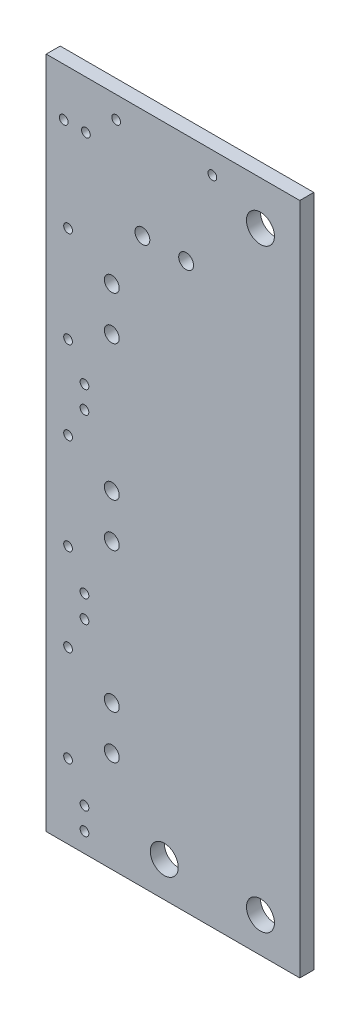
ISO-10303-21;
HEADER;
FILE_DESCRIPTION(('STEP AP214'),'2;1');
FILE_NAME('part.step','',(''),(''),'','','');
FILE_SCHEMA(('AUTOMOTIVE_DESIGN { 1 0 10303 214 1 1 1 1 }'));
ENDSEC;
DATA;
#1=APPLICATION_CONTEXT('core data for automotive mechanical design processes');
#2=APPLICATION_PROTOCOL_DEFINITION('international standard','automotive_design',2000,#1);
#3=PRODUCT_CONTEXT('',#1,'mechanical');
#4=PRODUCT('Part','Part','',(#3));
#5=PRODUCT_RELATED_PRODUCT_CATEGORY('part','',(#4));
#6=PRODUCT_DEFINITION_FORMATION('','',#4);
#7=PRODUCT_DEFINITION_CONTEXT('part definition',#1,'design');
#8=PRODUCT_DEFINITION('design','',#6,#7);
#9=PRODUCT_DEFINITION_SHAPE('','',#8);
#10=(LENGTH_UNIT() NAMED_UNIT(*) SI_UNIT(.MILLI.,.METRE.));
#11=(NAMED_UNIT(*) PLANE_ANGLE_UNIT() SI_UNIT($,.RADIAN.));
#12=(NAMED_UNIT(*) SI_UNIT($,.STERADIAN.) SOLID_ANGLE_UNIT());
#13=UNCERTAINTY_MEASURE_WITH_UNIT(LENGTH_MEASURE(1.E-05),#10,'distance_accuracy_value','');
#14=(GEOMETRIC_REPRESENTATION_CONTEXT(3) GLOBAL_UNCERTAINTY_ASSIGNED_CONTEXT((#13)) GLOBAL_UNIT_ASSIGNED_CONTEXT((#10,
#11,#12)) REPRESENTATION_CONTEXT('',''));
#15=CARTESIAN_POINT('',(0.,0.,0.));
#16=DIRECTION('',(0.,0.,1.));
#17=DIRECTION('',(1.,0.,0.));
#18=AXIS2_PLACEMENT_3D('',#15,#16,#17);
#19=CARTESIAN_POINT('',(126.,-46.,-0.045));
#20=DIRECTION('',(0.,0.,-1.));
#21=DIRECTION('',(0.,-1.,0.));
#22=AXIS2_PLACEMENT_3D('',#19,#20,#21);
#23=CYLINDRICAL_SURFACE('',#22,1.6);
#24=CARTESIAN_POINT('',(126.,-46.,0.));
#25=DIRECTION('',(0.,0.,-1.));
#26=DIRECTION('',(0.,-1.,0.));
#27=AXIS2_PLACEMENT_3D('',#24,#25,#26);
#28=CIRCLE('',#27,1.6);
#29=CARTESIAN_POINT('',(126.,-47.6,0.));
#30=VERTEX_POINT('',#29);
#31=EDGE_CURVE('E498',#30,#30,#28,.T.);
#32=ORIENTED_EDGE('',*,*,#31,.T.);
#33=DIRECTION('',(0.,0.,1.));
#34=VECTOR('',#33,1.);
#35=CARTESIAN_POINT('',(126.,-47.6,-0.045));
#36=LINE('',#35,#34);
#37=CARTESIAN_POINT('',(126.,-47.6,1.6));
#38=VERTEX_POINT('',#37);
#39=EDGE_CURVE('E11',#30,#38,#36,.T.);
#40=ORIENTED_EDGE('',*,*,#39,.T.);
#41=CARTESIAN_POINT('',(126.,-46.,1.6));
#42=DIRECTION('',(0.,0.,-1.));
#43=DIRECTION('',(0.,-1.,0.));
#44=AXIS2_PLACEMENT_3D('',#41,#42,#43);
#45=CIRCLE('',#44,1.6);
#46=EDGE_CURVE('E516',#38,#38,#45,.T.);
#47=ORIENTED_EDGE('',*,*,#46,.F.);
#48=ORIENTED_EDGE('',*,*,#39,.F.);
#49=EDGE_LOOP('',(#32,#40,#47,#48));
#50=FACE_BOUND('',#49,.T.);
#51=ADVANCED_FACE('F17',(#50),#23,.F.);
#52=CARTESIAN_POINT('',(120.5,-43.5,-0.045));
#53=DIRECTION('',(0.,0.,-1.));
#54=DIRECTION('',(0.,-1.,0.));
#55=AXIS2_PLACEMENT_3D('',#52,#53,#54);
#56=CYLINDRICAL_SURFACE('',#55,0.5);
#57=CARTESIAN_POINT('',(120.5,-43.5,0.));
#58=DIRECTION('',(0.,0.,-1.));
#59=DIRECTION('',(0.,-1.,0.));
#60=AXIS2_PLACEMENT_3D('',#57,#58,#59);
#61=CIRCLE('',#60,0.5);
#62=CARTESIAN_POINT('',(120.5,-44.,0.));
#63=VERTEX_POINT('',#62);
#64=EDGE_CURVE('E501',#63,#63,#61,.T.);
#65=ORIENTED_EDGE('',*,*,#64,.T.);
#66=DIRECTION('',(0.,0.,1.));
#67=VECTOR('',#66,1.);
#68=CARTESIAN_POINT('',(120.5,-44.,-0.045));
#69=LINE('',#68,#67);
#70=CARTESIAN_POINT('',(120.5,-44.,1.6));
#71=VERTEX_POINT('',#70);
#72=EDGE_CURVE('E26',#63,#71,#69,.T.);
#73=ORIENTED_EDGE('',*,*,#72,.T.);
#74=CARTESIAN_POINT('',(120.5,-43.5,1.6));
#75=DIRECTION('',(0.,0.,-1.));
#76=DIRECTION('',(0.,-1.,0.));
#77=AXIS2_PLACEMENT_3D('',#74,#75,#76);
#78=CIRCLE('',#77,0.5);
#79=EDGE_CURVE('E519',#71,#71,#78,.T.);
#80=ORIENTED_EDGE('',*,*,#79,.F.);
#81=ORIENTED_EDGE('',*,*,#72,.F.);
#82=EDGE_LOOP('',(#65,#73,#80,#81));
#83=FACE_BOUND('',#82,.T.);
#84=ADVANCED_FACE('F19',(#83),#56,.F.);
#85=CARTESIAN_POINT('',(117.5,-53.5,-0.045));
#86=DIRECTION('',(0.,0.,-1.));
#87=DIRECTION('',(0.,-1.,0.));
#88=AXIS2_PLACEMENT_3D('',#85,#86,#87);
#89=CYLINDRICAL_SURFACE('',#88,0.85);
#90=CARTESIAN_POINT('',(117.5,-53.5,0.));
#91=DIRECTION('',(0.,0.,-1.));
#92=DIRECTION('',(0.,-1.,0.));
#93=AXIS2_PLACEMENT_3D('',#90,#91,#92);
#94=CIRCLE('',#93,0.85);
#95=CARTESIAN_POINT('',(117.5,-54.35,0.));
#96=VERTEX_POINT('',#95);
#97=EDGE_CURVE('E505',#96,#96,#94,.T.);
#98=ORIENTED_EDGE('',*,*,#97,.T.);
#99=DIRECTION('',(0.,0.,1.));
#100=VECTOR('',#99,1.);
#101=CARTESIAN_POINT('',(117.5,-54.35,-0.045));
#102=LINE('',#101,#100);
#103=CARTESIAN_POINT('',(117.5,-54.35,1.6));
#104=VERTEX_POINT('',#103);
#105=EDGE_CURVE('E576',#96,#104,#102,.T.);
#106=ORIENTED_EDGE('',*,*,#105,.T.);
#107=CARTESIAN_POINT('',(117.5,-53.5,1.6));
#108=DIRECTION('',(0.,0.,-1.));
#109=DIRECTION('',(0.,-1.,0.));
#110=AXIS2_PLACEMENT_3D('',#107,#108,#109);
#111=CIRCLE('',#110,0.85);
#112=EDGE_CURVE('E563',#104,#104,#111,.T.);
#113=ORIENTED_EDGE('',*,*,#112,.F.);
#114=ORIENTED_EDGE('',*,*,#105,.F.);
#115=EDGE_LOOP('',(#98,#106,#113,#114));
#116=FACE_BOUND('',#115,.T.);
#117=ADVANCED_FACE('F637',(#116),#89,.F.);
#118=CARTESIAN_POINT('',(109.5,-43.5,-0.045));
#119=DIRECTION('',(0.,0.,-1.));
#120=DIRECTION('',(0.,-1.,0.));
#121=AXIS2_PLACEMENT_3D('',#118,#119,#120);
#122=CYLINDRICAL_SURFACE('',#121,0.5);
#123=CARTESIAN_POINT('',(109.5,-43.5,0.));
#124=DIRECTION('',(0.,0.,-1.));
#125=DIRECTION('',(0.,-1.,0.));
#126=AXIS2_PLACEMENT_3D('',#123,#124,#125);
#127=CIRCLE('',#126,0.5);
#128=CARTESIAN_POINT('',(109.5,-44.,0.));
#129=VERTEX_POINT('',#128);
#130=EDGE_CURVE('E497',#129,#129,#127,.T.);
#131=ORIENTED_EDGE('',*,*,#130,.T.);
#132=DIRECTION('',(0.,0.,1.));
#133=VECTOR('',#132,1.);
#134=CARTESIAN_POINT('',(109.5,-44.,-0.045));
#135=LINE('',#134,#133);
#136=CARTESIAN_POINT('',(109.5,-44.,1.6));
#137=VERTEX_POINT('',#136);
#138=EDGE_CURVE('E630',#129,#137,#135,.T.);
#139=ORIENTED_EDGE('',*,*,#138,.T.);
#140=CARTESIAN_POINT('',(109.5,-43.5,1.6));
#141=DIRECTION('',(0.,0.,-1.));
#142=DIRECTION('',(0.,-1.,0.));
#143=AXIS2_PLACEMENT_3D('',#140,#141,#142);
#144=CIRCLE('',#143,0.5);
#145=EDGE_CURVE('E567',#137,#137,#144,.T.);
#146=ORIENTED_EDGE('',*,*,#145,.F.);
#147=ORIENTED_EDGE('',*,*,#138,.F.);
#148=EDGE_LOOP('',(#131,#139,#146,#147));
#149=FACE_BOUND('',#148,.T.);
#150=ADVANCED_FACE('F772',(#149),#122,.F.);
#151=CARTESIAN_POINT('',(112.5,-53.5,-0.045));
#152=DIRECTION('',(0.,0.,-1.));
#153=DIRECTION('',(0.,-1.,0.));
#154=AXIS2_PLACEMENT_3D('',#151,#152,#153);
#155=CYLINDRICAL_SURFACE('',#154,0.85);
#156=CARTESIAN_POINT('',(112.5,-53.5,0.));
#157=DIRECTION('',(0.,0.,-1.));
#158=DIRECTION('',(0.,-1.,0.));
#159=AXIS2_PLACEMENT_3D('',#156,#157,#158);
#160=CIRCLE('',#159,0.85);
#161=CARTESIAN_POINT('',(112.5,-54.35,0.));
#162=VERTEX_POINT('',#161);
#163=EDGE_CURVE('E491',#162,#162,#160,.T.);
#164=ORIENTED_EDGE('',*,*,#163,.T.);
#165=DIRECTION('',(0.,0.,1.));
#166=VECTOR('',#165,1.);
#167=CARTESIAN_POINT('',(112.5,-54.35,-0.045));
#168=LINE('',#167,#166);
#169=CARTESIAN_POINT('',(112.5,-54.35,1.6));
#170=VERTEX_POINT('',#169);
#171=EDGE_CURVE('E625',#162,#170,#168,.T.);
#172=ORIENTED_EDGE('',*,*,#171,.T.);
#173=CARTESIAN_POINT('',(112.5,-53.5,1.6));
#174=DIRECTION('',(0.,0.,-1.));
#175=DIRECTION('',(0.,-1.,0.));
#176=AXIS2_PLACEMENT_3D('',#173,#174,#175);
#177=CIRCLE('',#176,0.85);
#178=EDGE_CURVE('E586',#170,#170,#177,.T.);
#179=ORIENTED_EDGE('',*,*,#178,.F.);
#180=ORIENTED_EDGE('',*,*,#171,.F.);
#181=EDGE_LOOP('',(#164,#172,#179,#180));
#182=FACE_BOUND('',#181,.T.);
#183=ADVANCED_FACE('F770',(#182),#155,.F.);
#184=CARTESIAN_POINT('',(106.04,-46.5,-0.045));
#185=DIRECTION('',(0.,0.,-1.));
#186=DIRECTION('',(0.,-1.,0.));
#187=AXIS2_PLACEMENT_3D('',#184,#185,#186);
#188=CYLINDRICAL_SURFACE('',#187,0.5);
#189=CARTESIAN_POINT('',(106.04,-46.5,0.));
#190=DIRECTION('',(0.,0.,-1.));
#191=DIRECTION('',(0.,-1.,0.));
#192=AXIS2_PLACEMENT_3D('',#189,#190,#191);
#193=CIRCLE('',#192,0.5);
#194=CARTESIAN_POINT('',(106.04,-47.,0.));
#195=VERTEX_POINT('',#194);
#196=EDGE_CURVE('E481',#195,#195,#193,.T.);
#197=ORIENTED_EDGE('',*,*,#196,.T.);
#198=DIRECTION('',(0.,0.,1.));
#199=VECTOR('',#198,1.);
#200=CARTESIAN_POINT('',(106.04,-47.,-0.045));
#201=LINE('',#200,#199);
#202=CARTESIAN_POINT('',(106.04,-47.,1.6));
#203=VERTEX_POINT('',#202);
#204=EDGE_CURVE('E622',#195,#203,#201,.T.);
#205=ORIENTED_EDGE('',*,*,#204,.T.);
#206=CARTESIAN_POINT('',(106.04,-46.5,1.6));
#207=DIRECTION('',(0.,0.,-1.));
#208=DIRECTION('',(0.,-1.,0.));
#209=AXIS2_PLACEMENT_3D('',#206,#207,#208);
#210=CIRCLE('',#209,0.5);
#211=EDGE_CURVE('E582',#203,#203,#210,.T.);
#212=ORIENTED_EDGE('',*,*,#211,.F.);
#213=ORIENTED_EDGE('',*,*,#204,.F.);
#214=EDGE_LOOP('',(#197,#205,#212,#213));
#215=FACE_BOUND('',#214,.T.);
#216=ADVANCED_FACE('F766',(#215),#188,.F.);
#217=CARTESIAN_POINT('',(103.5,-46.5,-0.045));
#218=DIRECTION('',(0.,0.,-1.));
#219=DIRECTION('',(0.,-1.,0.));
#220=AXIS2_PLACEMENT_3D('',#217,#218,#219);
#221=CYLINDRICAL_SURFACE('',#220,0.5);
#222=CARTESIAN_POINT('',(103.5,-46.5,0.));
#223=DIRECTION('',(0.,0.,-1.));
#224=DIRECTION('',(0.,-1.,0.));
#225=AXIS2_PLACEMENT_3D('',#222,#223,#224);
#226=CIRCLE('',#225,0.5);
#227=CARTESIAN_POINT('',(103.5,-47.,0.));
#228=VERTEX_POINT('',#227);
#229=EDGE_CURVE('E477',#228,#228,#226,.T.);
#230=ORIENTED_EDGE('',*,*,#229,.T.);
#231=DIRECTION('',(0.,0.,1.));
#232=VECTOR('',#231,1.);
#233=CARTESIAN_POINT('',(103.5,-47.,-0.045));
#234=LINE('',#233,#232);
#235=CARTESIAN_POINT('',(103.5,-47.,1.6));
#236=VERTEX_POINT('',#235);
#237=EDGE_CURVE('E621',#228,#236,#234,.T.);
#238=ORIENTED_EDGE('',*,*,#237,.T.);
#239=CARTESIAN_POINT('',(103.5,-46.5,1.6));
#240=DIRECTION('',(0.,0.,-1.));
#241=DIRECTION('',(0.,-1.,0.));
#242=AXIS2_PLACEMENT_3D('',#239,#240,#241);
#243=CIRCLE('',#242,0.5);
#244=EDGE_CURVE('E363',#236,#236,#243,.T.);
#245=ORIENTED_EDGE('',*,*,#244,.F.);
#246=ORIENTED_EDGE('',*,*,#237,.F.);
#247=EDGE_LOOP('',(#230,#238,#245,#246));
#248=FACE_BOUND('',#247,.T.);
#249=ADVANCED_FACE('F762',(#248),#221,.F.);
#250=CARTESIAN_POINT('',(109.,-60.,-0.045));
#251=DIRECTION('',(0.,0.,-1.));
#252=DIRECTION('',(0.,-1.,0.));
#253=AXIS2_PLACEMENT_3D('',#250,#251,#252);
#254=CYLINDRICAL_SURFACE('',#253,0.85);
#255=CARTESIAN_POINT('',(109.,-60.,0.));
#256=DIRECTION('',(0.,0.,-1.));
#257=DIRECTION('',(0.,-1.,0.));
#258=AXIS2_PLACEMENT_3D('',#255,#256,#257);
#259=CIRCLE('',#258,0.85);
#260=CARTESIAN_POINT('',(109.,-60.85,0.));
#261=VERTEX_POINT('',#260);
#262=EDGE_CURVE('E473',#261,#261,#259,.T.);
#263=ORIENTED_EDGE('',*,*,#262,.T.);
#264=DIRECTION('',(0.,0.,1.));
#265=VECTOR('',#264,1.);
#266=CARTESIAN_POINT('',(109.,-60.85,-0.045));
#267=LINE('',#266,#265);
#268=CARTESIAN_POINT('',(109.,-60.85,1.6));
#269=VERTEX_POINT('',#268);
#270=EDGE_CURVE('E410',#261,#269,#267,.T.);
#271=ORIENTED_EDGE('',*,*,#270,.T.);
#272=CARTESIAN_POINT('',(109.,-60.,1.6));
#273=DIRECTION('',(0.,0.,-1.));
#274=DIRECTION('',(0.,-1.,0.));
#275=AXIS2_PLACEMENT_3D('',#272,#273,#274);
#276=CIRCLE('',#275,0.85);
#277=EDGE_CURVE('E359',#269,#269,#276,.T.);
#278=ORIENTED_EDGE('',*,*,#277,.F.);
#279=ORIENTED_EDGE('',*,*,#270,.F.);
#280=EDGE_LOOP('',(#263,#271,#278,#279));
#281=FACE_BOUND('',#280,.T.);
#282=ADVANCED_FACE('F744',(#281),#254,.F.);
#283=CARTESIAN_POINT('',(104.,-57.,-0.045));
#284=DIRECTION('',(0.,0.,-1.));
#285=DIRECTION('',(0.,-1.,0.));
#286=AXIS2_PLACEMENT_3D('',#283,#284,#285);
#287=CYLINDRICAL_SURFACE('',#286,0.5);
#288=CARTESIAN_POINT('',(104.,-57.,0.));
#289=DIRECTION('',(0.,0.,-1.));
#290=DIRECTION('',(0.,-1.,0.));
#291=AXIS2_PLACEMENT_3D('',#288,#289,#290);
#292=CIRCLE('',#291,0.5);
#293=CARTESIAN_POINT('',(104.,-57.5,0.));
#294=VERTEX_POINT('',#293);
#295=EDGE_CURVE('E461',#294,#294,#292,.T.);
#296=ORIENTED_EDGE('',*,*,#295,.T.);
#297=DIRECTION('',(0.,0.,1.));
#298=VECTOR('',#297,1.);
#299=CARTESIAN_POINT('',(104.,-57.5,-0.045));
#300=LINE('',#299,#298);
#301=CARTESIAN_POINT('',(104.,-57.5,1.6));
#302=VERTEX_POINT('',#301);
#303=EDGE_CURVE('E407',#294,#302,#300,.T.);
#304=ORIENTED_EDGE('',*,*,#303,.T.);
#305=CARTESIAN_POINT('',(104.,-57.,1.6));
#306=DIRECTION('',(0.,0.,-1.));
#307=DIRECTION('',(0.,-1.,0.));
#308=AXIS2_PLACEMENT_3D('',#305,#306,#307);
#309=CIRCLE('',#308,0.5);
#310=EDGE_CURVE('E364',#302,#302,#309,.T.);
#311=ORIENTED_EDGE('',*,*,#310,.F.);
#312=ORIENTED_EDGE('',*,*,#303,.F.);
#313=EDGE_LOOP('',(#296,#304,#311,#312));
#314=FACE_BOUND('',#313,.T.);
#315=ADVANCED_FACE('F740',(#314),#287,.F.);
#316=CARTESIAN_POINT('',(109.,-65.,-0.045));
#317=DIRECTION('',(0.,0.,-1.));
#318=DIRECTION('',(0.,-1.,0.));
#319=AXIS2_PLACEMENT_3D('',#316,#317,#318);
#320=CYLINDRICAL_SURFACE('',#319,0.85);
#321=CARTESIAN_POINT('',(109.,-65.,0.));
#322=DIRECTION('',(0.,0.,-1.));
#323=DIRECTION('',(0.,-1.,0.));
#324=AXIS2_PLACEMENT_3D('',#321,#322,#323);
#325=CIRCLE('',#324,0.85);
#326=CARTESIAN_POINT('',(109.,-65.85,0.));
#327=VERTEX_POINT('',#326);
#328=EDGE_CURVE('E454',#327,#327,#325,.T.);
#329=ORIENTED_EDGE('',*,*,#328,.T.);
#330=DIRECTION('',(0.,0.,1.));
#331=VECTOR('',#330,1.);
#332=CARTESIAN_POINT('',(109.,-65.85,-0.045));
#333=LINE('',#332,#331);
#334=CARTESIAN_POINT('',(109.,-65.85,1.6));
#335=VERTEX_POINT('',#334);
#336=EDGE_CURVE('E411',#327,#335,#333,.T.);
#337=ORIENTED_EDGE('',*,*,#336,.T.);
#338=CARTESIAN_POINT('',(109.,-65.,1.6));
#339=DIRECTION('',(0.,0.,-1.));
#340=DIRECTION('',(0.,-1.,0.));
#341=AXIS2_PLACEMENT_3D('',#338,#339,#340);
#342=CIRCLE('',#341,0.85);
#343=EDGE_CURVE('E443',#335,#335,#342,.T.);
#344=ORIENTED_EDGE('',*,*,#343,.F.);
#345=ORIENTED_EDGE('',*,*,#336,.F.);
#346=EDGE_LOOP('',(#329,#337,#344,#345));
#347=FACE_BOUND('',#346,.T.);
#348=ADVANCED_FACE('F743',(#347),#320,.F.);
#349=CARTESIAN_POINT('',(104.,-68.,-0.045));
#350=DIRECTION('',(0.,0.,-1.));
#351=DIRECTION('',(0.,-1.,0.));
#352=AXIS2_PLACEMENT_3D('',#349,#350,#351);
#353=CYLINDRICAL_SURFACE('',#352,0.5);
#354=CARTESIAN_POINT('',(104.,-68.,0.));
#355=DIRECTION('',(0.,0.,-1.));
#356=DIRECTION('',(0.,-1.,0.));
#357=AXIS2_PLACEMENT_3D('',#354,#355,#356);
#358=CIRCLE('',#357,0.5);
#359=CARTESIAN_POINT('',(104.,-68.5,0.));
#360=VERTEX_POINT('',#359);
#361=EDGE_CURVE('E354',#360,#360,#358,.T.);
#362=ORIENTED_EDGE('',*,*,#361,.T.);
#363=DIRECTION('',(0.,0.,1.));
#364=VECTOR('',#363,1.);
#365=CARTESIAN_POINT('',(104.,-68.5,-0.045));
#366=LINE('',#365,#364);
#367=CARTESIAN_POINT('',(104.,-68.5,1.6));
#368=VERTEX_POINT('',#367);
#369=EDGE_CURVE('E382',#360,#368,#366,.T.);
#370=ORIENTED_EDGE('',*,*,#369,.T.);
#371=CARTESIAN_POINT('',(104.,-68.,1.6));
#372=DIRECTION('',(0.,0.,-1.));
#373=DIRECTION('',(0.,-1.,0.));
#374=AXIS2_PLACEMENT_3D('',#371,#372,#373);
#375=CIRCLE('',#374,0.5);
#376=EDGE_CURVE('E447',#368,#368,#375,.T.);
#377=ORIENTED_EDGE('',*,*,#376,.F.);
#378=ORIENTED_EDGE('',*,*,#369,.F.);
#379=EDGE_LOOP('',(#362,#370,#377,#378));
#380=FACE_BOUND('',#379,.T.);
#381=ADVANCED_FACE('F752',(#380),#353,.F.);
#382=CARTESIAN_POINT('',(105.875,-71.5,-0.045));
#383=DIRECTION('',(0.,0.,-1.));
#384=DIRECTION('',(0.,-1.,0.));
#385=AXIS2_PLACEMENT_3D('',#382,#383,#384);
#386=CYLINDRICAL_SURFACE('',#385,0.5);
#387=CARTESIAN_POINT('',(105.875,-71.5,0.));
#388=DIRECTION('',(0.,0.,-1.));
#389=DIRECTION('',(0.,-1.,0.));
#390=AXIS2_PLACEMENT_3D('',#387,#388,#389);
#391=CIRCLE('',#390,0.5);
#392=CARTESIAN_POINT('',(105.875,-72.,0.));
#393=VERTEX_POINT('',#392);
#394=EDGE_CURVE('E351',#393,#393,#391,.T.);
#395=ORIENTED_EDGE('',*,*,#394,.T.);
#396=DIRECTION('',(0.,0.,1.));
#397=VECTOR('',#396,1.);
#398=CARTESIAN_POINT('',(105.875,-72.,-0.045));
#399=LINE('',#398,#397);
#400=CARTESIAN_POINT('',(105.875,-72.,1.6));
#401=VERTEX_POINT('',#400);
#402=EDGE_CURVE('E379',#393,#401,#399,.T.);
#403=ORIENTED_EDGE('',*,*,#402,.T.);
#404=CARTESIAN_POINT('',(105.875,-71.5,1.6));
#405=DIRECTION('',(0.,0.,-1.));
#406=DIRECTION('',(0.,-1.,0.));
#407=AXIS2_PLACEMENT_3D('',#404,#405,#406);
#408=CIRCLE('',#407,0.5);
#409=EDGE_CURVE('E533',#401,#401,#408,.T.);
#410=ORIENTED_EDGE('',*,*,#409,.F.);
#411=ORIENTED_EDGE('',*,*,#402,.F.);
#412=EDGE_LOOP('',(#395,#403,#410,#411));
#413=FACE_BOUND('',#412,.T.);
#414=ADVANCED_FACE('F748',(#413),#386,.F.);
#415=CARTESIAN_POINT('',(105.875,-74.04,-0.045));
#416=DIRECTION('',(0.,0.,-1.));
#417=DIRECTION('',(0.,-1.,0.));
#418=AXIS2_PLACEMENT_3D('',#415,#416,#417);
#419=CYLINDRICAL_SURFACE('',#418,0.5);
#420=CARTESIAN_POINT('',(105.875,-74.04,0.));
#421=DIRECTION('',(0.,0.,-1.));
#422=DIRECTION('',(0.,-1.,0.));
#423=AXIS2_PLACEMENT_3D('',#420,#421,#422);
#424=CIRCLE('',#423,0.5);
#425=CARTESIAN_POINT('',(105.875,-74.54,0.));
#426=VERTEX_POINT('',#425);
#427=EDGE_CURVE('E355',#426,#426,#424,.T.);
#428=ORIENTED_EDGE('',*,*,#427,.T.);
#429=DIRECTION('',(0.,0.,1.));
#430=VECTOR('',#429,1.);
#431=CARTESIAN_POINT('',(105.875,-74.54,-0.045));
#432=LINE('',#431,#430);
#433=CARTESIAN_POINT('',(105.875,-74.54,1.6));
#434=VERTEX_POINT('',#433);
#435=EDGE_CURVE('E383',#426,#434,#432,.T.);
#436=ORIENTED_EDGE('',*,*,#435,.T.);
#437=CARTESIAN_POINT('',(105.875,-74.04,1.6));
#438=DIRECTION('',(0.,0.,-1.));
#439=DIRECTION('',(0.,-1.,0.));
#440=AXIS2_PLACEMENT_3D('',#437,#438,#439);
#441=CIRCLE('',#440,0.5);
#442=EDGE_CURVE('E369',#434,#434,#441,.T.);
#443=ORIENTED_EDGE('',*,*,#442,.F.);
#444=ORIENTED_EDGE('',*,*,#435,.F.);
#445=EDGE_LOOP('',(#428,#436,#443,#444));
#446=FACE_BOUND('',#445,.T.);
#447=ADVANCED_FACE('F738',(#446),#419,.F.);
#448=CARTESIAN_POINT('',(104.,-77.5,-0.045));
#449=DIRECTION('',(0.,0.,-1.));
#450=DIRECTION('',(0.,-1.,0.));
#451=AXIS2_PLACEMENT_3D('',#448,#449,#450);
#452=CYLINDRICAL_SURFACE('',#451,0.5);
#453=CARTESIAN_POINT('',(104.,-77.5,0.));
#454=DIRECTION('',(0.,0.,-1.));
#455=DIRECTION('',(0.,-1.,0.));
#456=AXIS2_PLACEMENT_3D('',#453,#454,#455);
#457=CIRCLE('',#456,0.5);
#458=CARTESIAN_POINT('',(104.,-78.,0.));
#459=VERTEX_POINT('',#458);
#460=EDGE_CURVE('E387',#459,#459,#457,.T.);
#461=ORIENTED_EDGE('',*,*,#460,.T.);
#462=DIRECTION('',(0.,0.,1.));
#463=VECTOR('',#462,1.);
#464=CARTESIAN_POINT('',(104.,-78.,-0.045));
#465=LINE('',#464,#463);
#466=CARTESIAN_POINT('',(104.,-78.,1.6));
#467=VERTEX_POINT('',#466);
#468=EDGE_CURVE('E457',#459,#467,#465,.T.);
#469=ORIENTED_EDGE('',*,*,#468,.T.);
#470=CARTESIAN_POINT('',(104.,-77.5,1.6));
#471=DIRECTION('',(0.,0.,-1.));
#472=DIRECTION('',(0.,-1.,0.));
#473=AXIS2_PLACEMENT_3D('',#470,#471,#472);
#474=CIRCLE('',#473,0.5);
#475=EDGE_CURVE('E365',#467,#467,#474,.T.);
#476=ORIENTED_EDGE('',*,*,#475,.F.);
#477=ORIENTED_EDGE('',*,*,#468,.F.);
#478=EDGE_LOOP('',(#461,#469,#476,#477));
#479=FACE_BOUND('',#478,.T.);
#480=ADVANCED_FACE('F734',(#479),#452,.F.);
#481=CARTESIAN_POINT('',(126.,-114.,-0.045));
#482=DIRECTION('',(0.,0.,-1.));
#483=DIRECTION('',(0.,-1.,0.));
#484=AXIS2_PLACEMENT_3D('',#481,#482,#483);
#485=CYLINDRICAL_SURFACE('',#484,1.6);
#486=CARTESIAN_POINT('',(126.,-114.,0.));
#487=DIRECTION('',(0.,0.,-1.));
#488=DIRECTION('',(0.,-1.,0.));
#489=AXIS2_PLACEMENT_3D('',#486,#487,#488);
#490=CIRCLE('',#489,1.6);
#491=CARTESIAN_POINT('',(126.,-115.6,0.));
#492=VERTEX_POINT('',#491);
#493=EDGE_CURVE('E384',#492,#492,#490,.T.);
#494=ORIENTED_EDGE('',*,*,#493,.T.);
#495=DIRECTION('',(0.,0.,1.));
#496=VECTOR('',#495,1.);
#497=CARTESIAN_POINT('',(126.,-115.6,-0.045));
#498=LINE('',#497,#496);
#499=CARTESIAN_POINT('',(126.,-115.6,1.6));
#500=VERTEX_POINT('',#499);
#501=EDGE_CURVE('E614',#492,#500,#498,.T.);
#502=ORIENTED_EDGE('',*,*,#501,.T.);
#503=CARTESIAN_POINT('',(126.,-114.,1.6));
#504=DIRECTION('',(0.,0.,-1.));
#505=DIRECTION('',(0.,-1.,0.));
#506=AXIS2_PLACEMENT_3D('',#503,#504,#505);
#507=CIRCLE('',#506,1.6);
#508=EDGE_CURVE('E370',#500,#500,#507,.T.);
#509=ORIENTED_EDGE('',*,*,#508,.F.);
#510=ORIENTED_EDGE('',*,*,#501,.F.);
#511=EDGE_LOOP('',(#494,#502,#509,#510));
#512=FACE_BOUND('',#511,.T.);
#513=ADVANCED_FACE('F730',(#512),#485,.F.);
#514=CARTESIAN_POINT('',(109.,-80.5,-0.045));
#515=DIRECTION('',(0.,0.,-1.));
#516=DIRECTION('',(0.,-1.,0.));
#517=AXIS2_PLACEMENT_3D('',#514,#515,#516);
#518=CYLINDRICAL_SURFACE('',#517,0.85);
#519=CARTESIAN_POINT('',(109.,-80.5,0.));
#520=DIRECTION('',(0.,0.,-1.));
#521=DIRECTION('',(0.,-1.,0.));
#522=AXIS2_PLACEMENT_3D('',#519,#520,#521);
#523=CIRCLE('',#522,0.85);
#524=CARTESIAN_POINT('',(109.,-81.35,0.));
#525=VERTEX_POINT('',#524);
#526=EDGE_CURVE('E388',#525,#525,#523,.T.);
#527=ORIENTED_EDGE('',*,*,#526,.T.);
#528=DIRECTION('',(0.,0.,1.));
#529=VECTOR('',#528,1.);
#530=CARTESIAN_POINT('',(109.,-81.35,-0.045));
#531=LINE('',#530,#529);
#532=CARTESIAN_POINT('',(109.,-81.35,1.6));
#533=VERTEX_POINT('',#532);
#534=EDGE_CURVE('E611',#525,#533,#531,.T.);
#535=ORIENTED_EDGE('',*,*,#534,.T.);
#536=CARTESIAN_POINT('',(109.,-80.5,1.6));
#537=DIRECTION('',(0.,0.,-1.));
#538=DIRECTION('',(0.,-1.,0.));
#539=AXIS2_PLACEMENT_3D('',#536,#537,#538);
#540=CIRCLE('',#539,0.85);
#541=EDGE_CURVE('E553',#533,#533,#540,.T.);
#542=ORIENTED_EDGE('',*,*,#541,.F.);
#543=ORIENTED_EDGE('',*,*,#534,.F.);
#544=EDGE_LOOP('',(#527,#535,#542,#543));
#545=FACE_BOUND('',#544,.T.);
#546=ADVANCED_FACE('F727',(#545),#518,.F.);
#547=CARTESIAN_POINT('',(109.,-85.5,-0.045));
#548=DIRECTION('',(0.,0.,-1.));
#549=DIRECTION('',(0.,-1.,0.));
#550=AXIS2_PLACEMENT_3D('',#547,#548,#549);
#551=CYLINDRICAL_SURFACE('',#550,0.85);
#552=CARTESIAN_POINT('',(109.,-85.5,0.));
#553=DIRECTION('',(0.,0.,-1.));
#554=DIRECTION('',(0.,-1.,0.));
#555=AXIS2_PLACEMENT_3D('',#552,#553,#554);
#556=CIRCLE('',#555,0.85);
#557=CARTESIAN_POINT('',(109.,-86.35,0.));
#558=VERTEX_POINT('',#557);
#559=EDGE_CURVE('E426',#558,#558,#556,.T.);
#560=ORIENTED_EDGE('',*,*,#559,.T.);
#561=DIRECTION('',(0.,0.,1.));
#562=VECTOR('',#561,1.);
#563=CARTESIAN_POINT('',(109.,-86.35,-0.045));
#564=LINE('',#563,#562);
#565=CARTESIAN_POINT('',(109.,-86.35,1.6));
#566=VERTEX_POINT('',#565);
#567=EDGE_CURVE('E608',#558,#566,#564,.T.);
#568=ORIENTED_EDGE('',*,*,#567,.T.);
#569=CARTESIAN_POINT('',(109.,-85.5,1.6));
#570=DIRECTION('',(0.,0.,-1.));
#571=DIRECTION('',(0.,-1.,0.));
#572=AXIS2_PLACEMENT_3D('',#569,#570,#571);
#573=CIRCLE('',#572,0.85);
#574=EDGE_CURVE('E549',#566,#566,#573,.T.);
#575=ORIENTED_EDGE('',*,*,#574,.F.);
#576=ORIENTED_EDGE('',*,*,#567,.F.);
#577=EDGE_LOOP('',(#560,#568,#575,#576));
#578=FACE_BOUND('',#577,.T.);
#579=ADVANCED_FACE('F725',(#578),#551,.F.);
#580=CARTESIAN_POINT('',(104.,-88.5,-0.045));
#581=DIRECTION('',(0.,0.,-1.));
#582=DIRECTION('',(0.,-1.,0.));
#583=AXIS2_PLACEMENT_3D('',#580,#581,#582);
#584=CYLINDRICAL_SURFACE('',#583,0.5);
#585=CARTESIAN_POINT('',(104.,-88.5,0.));
#586=DIRECTION('',(0.,0.,-1.));
#587=DIRECTION('',(0.,-1.,0.));
#588=AXIS2_PLACEMENT_3D('',#585,#586,#587);
#589=CIRCLE('',#588,0.5);
#590=CARTESIAN_POINT('',(104.,-89.,0.));
#591=VERTEX_POINT('',#590);
#592=EDGE_CURVE('E433',#591,#591,#589,.T.);
#593=ORIENTED_EDGE('',*,*,#592,.T.);
#594=DIRECTION('',(0.,0.,1.));
#595=VECTOR('',#594,1.);
#596=CARTESIAN_POINT('',(104.,-89.,-0.045));
#597=LINE('',#596,#595);
#598=CARTESIAN_POINT('',(104.,-89.,1.6));
#599=VERTEX_POINT('',#598);
#600=EDGE_CURVE('E605',#591,#599,#597,.T.);
#601=ORIENTED_EDGE('',*,*,#600,.T.);
#602=CARTESIAN_POINT('',(104.,-88.5,1.6));
#603=DIRECTION('',(0.,0.,-1.));
#604=DIRECTION('',(0.,-1.,0.));
#605=AXIS2_PLACEMENT_3D('',#602,#603,#604);
#606=CIRCLE('',#605,0.5);
#607=EDGE_CURVE('E468',#599,#599,#606,.T.);
#608=ORIENTED_EDGE('',*,*,#607,.F.);
#609=ORIENTED_EDGE('',*,*,#600,.F.);
#610=EDGE_LOOP('',(#593,#601,#608,#609));
#611=FACE_BOUND('',#610,.T.);
#612=ADVANCED_FACE('F722',(#611),#584,.F.);
#613=CARTESIAN_POINT('',(105.875,-92.235,-0.045));
#614=DIRECTION('',(0.,0.,-1.));
#615=DIRECTION('',(0.,-1.,0.));
#616=AXIS2_PLACEMENT_3D('',#613,#614,#615);
#617=CYLINDRICAL_SURFACE('',#616,0.5);
#618=CARTESIAN_POINT('',(105.875,-92.235,0.));
#619=DIRECTION('',(0.,0.,-1.));
#620=DIRECTION('',(0.,-1.,0.));
#621=AXIS2_PLACEMENT_3D('',#618,#619,#620);
#622=CIRCLE('',#621,0.5);
#623=CARTESIAN_POINT('',(105.875,-92.735,0.));
#624=VERTEX_POINT('',#623);
#625=EDGE_CURVE('E375',#624,#624,#622,.T.);
#626=ORIENTED_EDGE('',*,*,#625,.T.);
#627=DIRECTION('',(0.,0.,1.));
#628=VECTOR('',#627,1.);
#629=CARTESIAN_POINT('',(105.875,-92.735,-0.045));
#630=LINE('',#629,#628);
#631=CARTESIAN_POINT('',(105.875,-92.735,1.6));
#632=VERTEX_POINT('',#631);
#633=EDGE_CURVE('E344',#624,#632,#630,.T.);
#634=ORIENTED_EDGE('',*,*,#633,.T.);
#635=CARTESIAN_POINT('',(105.875,-92.235,1.6));
#636=DIRECTION('',(0.,0.,-1.));
#637=DIRECTION('',(0.,-1.,0.));
#638=AXIS2_PLACEMENT_3D('',#635,#636,#637);
#639=CIRCLE('',#638,0.5);
#640=EDGE_CURVE('E464',#632,#632,#639,.T.);
#641=ORIENTED_EDGE('',*,*,#640,.F.);
#642=ORIENTED_EDGE('',*,*,#633,.F.);
#643=EDGE_LOOP('',(#626,#634,#641,#642));
#644=FACE_BOUND('',#643,.T.);
#645=ADVANCED_FACE('F720',(#644),#617,.F.);
#646=CARTESIAN_POINT('',(105.875,-94.775,-0.045));
#647=DIRECTION('',(0.,0.,-1.));
#648=DIRECTION('',(0.,-1.,0.));
#649=AXIS2_PLACEMENT_3D('',#646,#647,#648);
#650=CYLINDRICAL_SURFACE('',#649,0.5);
#651=CARTESIAN_POINT('',(105.875,-94.775,0.));
#652=DIRECTION('',(0.,0.,-1.));
#653=DIRECTION('',(0.,-1.,0.));
#654=AXIS2_PLACEMENT_3D('',#651,#652,#653);
#655=CIRCLE('',#654,0.5);
#656=CARTESIAN_POINT('',(105.875,-95.275,0.));
#657=VERTEX_POINT('',#656);
#658=EDGE_CURVE('E371',#657,#657,#655,.T.);
#659=ORIENTED_EDGE('',*,*,#658,.T.);
#660=DIRECTION('',(0.,0.,1.));
#661=VECTOR('',#660,1.);
#662=CARTESIAN_POINT('',(105.875,-95.275,-0.045));
#663=LINE('',#662,#661);
#664=CARTESIAN_POINT('',(105.875,-95.275,1.6));
#665=VERTEX_POINT('',#664);
#666=EDGE_CURVE('E341',#657,#665,#663,.T.);
#667=ORIENTED_EDGE('',*,*,#666,.T.);
#668=CARTESIAN_POINT('',(105.875,-94.775,1.6));
#669=DIRECTION('',(0.,0.,-1.));
#670=DIRECTION('',(0.,-1.,0.));
#671=AXIS2_PLACEMENT_3D('',#668,#669,#670);
#672=CIRCLE('',#671,0.5);
#673=EDGE_CURVE('E469',#665,#665,#672,.T.);
#674=ORIENTED_EDGE('',*,*,#673,.F.);
#675=ORIENTED_EDGE('',*,*,#666,.F.);
#676=EDGE_LOOP('',(#659,#667,#674,#675));
#677=FACE_BOUND('',#676,.T.);
#678=ADVANCED_FACE('F872',(#677),#650,.F.);
#679=CARTESIAN_POINT('',(115.,-114.,-0.045));
#680=DIRECTION('',(0.,0.,-1.));
#681=DIRECTION('',(0.,-1.,0.));
#682=AXIS2_PLACEMENT_3D('',#679,#680,#681);
#683=CYLINDRICAL_SURFACE('',#682,1.6);
#684=CARTESIAN_POINT('',(115.,-114.,0.));
#685=DIRECTION('',(0.,0.,-1.));
#686=DIRECTION('',(0.,-1.,0.));
#687=AXIS2_PLACEMENT_3D('',#684,#685,#686);
#688=CIRCLE('',#687,1.6);
#689=CARTESIAN_POINT('',(115.,-115.6,0.));
#690=VERTEX_POINT('',#689);
#691=EDGE_CURVE('E376',#690,#690,#688,.T.);
#692=ORIENTED_EDGE('',*,*,#691,.T.);
#693=DIRECTION('',(0.,0.,1.));
#694=VECTOR('',#693,1.);
#695=CARTESIAN_POINT('',(115.,-115.6,-0.045));
#696=LINE('',#695,#694);
#697=CARTESIAN_POINT('',(115.,-115.6,1.6));
#698=VERTEX_POINT('',#697);
#699=EDGE_CURVE('E345',#690,#698,#696,.T.);
#700=ORIENTED_EDGE('',*,*,#699,.T.);
#701=CARTESIAN_POINT('',(115.,-114.,1.6));
#702=DIRECTION('',(0.,0.,-1.));
#703=DIRECTION('',(0.,-1.,0.));
#704=AXIS2_PLACEMENT_3D('',#701,#702,#703);
#705=CIRCLE('',#704,1.6);
#706=EDGE_CURVE('E486',#698,#698,#705,.T.);
#707=ORIENTED_EDGE('',*,*,#706,.F.);
#708=ORIENTED_EDGE('',*,*,#699,.F.);
#709=EDGE_LOOP('',(#692,#700,#707,#708));
#710=FACE_BOUND('',#709,.T.);
#711=ADVANCED_FACE('F880',(#710),#683,.F.);
#712=CARTESIAN_POINT('',(109.,-101.5,-0.045));
#713=DIRECTION('',(0.,0.,-1.));
#714=DIRECTION('',(0.,-1.,0.));
#715=AXIS2_PLACEMENT_3D('',#712,#713,#714);
#716=CYLINDRICAL_SURFACE('',#715,0.85);
#717=CARTESIAN_POINT('',(109.,-101.5,0.));
#718=DIRECTION('',(0.,0.,-1.));
#719=DIRECTION('',(0.,-1.,0.));
#720=AXIS2_PLACEMENT_3D('',#717,#718,#719);
#721=CIRCLE('',#720,0.85);
#722=CARTESIAN_POINT('',(109.,-102.35,0.));
#723=VERTEX_POINT('',#722);
#724=EDGE_CURVE('E419',#723,#723,#721,.T.);
#725=ORIENTED_EDGE('',*,*,#724,.T.);
#726=DIRECTION('',(0.,0.,1.));
#727=VECTOR('',#726,1.);
#728=CARTESIAN_POINT('',(109.,-102.35,-0.045));
#729=LINE('',#728,#727);
#730=CARTESIAN_POINT('',(109.,-102.35,1.6));
#731=VERTEX_POINT('',#730);
#732=EDGE_CURVE('E349',#723,#731,#729,.T.);
#733=ORIENTED_EDGE('',*,*,#732,.T.);
#734=CARTESIAN_POINT('',(109.,-101.5,1.6));
#735=DIRECTION('',(0.,0.,-1.));
#736=DIRECTION('',(0.,-1.,0.));
#737=AXIS2_PLACEMENT_3D('',#734,#735,#736);
#738=CIRCLE('',#737,0.85);
#739=EDGE_CURVE('E482',#731,#731,#738,.T.);
#740=ORIENTED_EDGE('',*,*,#739,.F.);
#741=ORIENTED_EDGE('',*,*,#732,.F.);
#742=EDGE_LOOP('',(#725,#733,#740,#741));
#743=FACE_BOUND('',#742,.T.);
#744=ADVANCED_FACE('F889',(#743),#716,.F.);
#745=CARTESIAN_POINT('',(109.,-106.5,-0.045));
#746=DIRECTION('',(0.,0.,-1.));
#747=DIRECTION('',(0.,-1.,0.));
#748=AXIS2_PLACEMENT_3D('',#745,#746,#747);
#749=CYLINDRICAL_SURFACE('',#748,0.85);
#750=CARTESIAN_POINT('',(109.,-106.5,0.));
#751=DIRECTION('',(0.,0.,-1.));
#752=DIRECTION('',(0.,-1.,0.));
#753=AXIS2_PLACEMENT_3D('',#750,#751,#752);
#754=CIRCLE('',#753,0.85);
#755=CARTESIAN_POINT('',(109.,-107.35,0.));
#756=VERTEX_POINT('',#755);
#757=EDGE_CURVE('E415',#756,#756,#754,.T.);
#758=ORIENTED_EDGE('',*,*,#757,.T.);
#759=DIRECTION('',(0.,0.,1.));
#760=VECTOR('',#759,1.);
#761=CARTESIAN_POINT('',(109.,-107.35,-0.045));
#762=LINE('',#761,#760);
#763=CARTESIAN_POINT('',(109.,-107.35,1.6));
#764=VERTEX_POINT('',#763);
#765=EDGE_CURVE('E346',#756,#764,#762,.T.);
#766=ORIENTED_EDGE('',*,*,#765,.T.);
#767=CARTESIAN_POINT('',(109.,-106.5,1.6));
#768=DIRECTION('',(0.,0.,-1.));
#769=DIRECTION('',(0.,-1.,0.));
#770=AXIS2_PLACEMENT_3D('',#767,#768,#769);
#771=CIRCLE('',#770,0.85);
#772=EDGE_CURVE('E487',#764,#764,#771,.T.);
#773=ORIENTED_EDGE('',*,*,#772,.F.);
#774=ORIENTED_EDGE('',*,*,#765,.F.);
#775=EDGE_LOOP('',(#758,#766,#773,#774));
#776=FACE_BOUND('',#775,.T.);
#777=ADVANCED_FACE('F898',(#776),#749,.F.);
#778=CARTESIAN_POINT('',(104.,-98.5,-0.045));
#779=DIRECTION('',(0.,0.,-1.));
#780=DIRECTION('',(0.,-1.,0.));
#781=AXIS2_PLACEMENT_3D('',#778,#779,#780);
#782=CYLINDRICAL_SURFACE('',#781,0.5);
#783=CARTESIAN_POINT('',(104.,-98.5,0.));
#784=DIRECTION('',(0.,0.,-1.));
#785=DIRECTION('',(0.,-1.,0.));
#786=AXIS2_PLACEMENT_3D('',#783,#784,#785);
#787=CIRCLE('',#786,0.5);
#788=CARTESIAN_POINT('',(104.,-99.,0.));
#789=VERTEX_POINT('',#788);
#790=EDGE_CURVE('E328',#789,#789,#787,.T.);
#791=ORIENTED_EDGE('',*,*,#790,.T.);
#792=DIRECTION('',(0.,0.,1.));
#793=VECTOR('',#792,1.);
#794=CARTESIAN_POINT('',(104.,-99.,-0.045));
#795=LINE('',#794,#793);
#796=CARTESIAN_POINT('',(104.,-99.,1.6));
#797=VERTEX_POINT('',#796);
#798=EDGE_CURVE('E350',#789,#797,#795,.T.);
#799=ORIENTED_EDGE('',*,*,#798,.T.);
#800=CARTESIAN_POINT('',(104.,-98.5,1.6));
#801=DIRECTION('',(0.,0.,-1.));
#802=DIRECTION('',(0.,-1.,0.));
#803=AXIS2_PLACEMENT_3D('',#800,#801,#802);
#804=CIRCLE('',#803,0.5);
#805=EDGE_CURVE('E529',#797,#797,#804,.T.);
#806=ORIENTED_EDGE('',*,*,#805,.F.);
#807=ORIENTED_EDGE('',*,*,#798,.F.);
#808=EDGE_LOOP('',(#791,#799,#806,#807));
#809=FACE_BOUND('',#808,.T.);
#810=ADVANCED_FACE('F907',(#809),#782,.F.);
#811=CARTESIAN_POINT('',(104.,-109.5,-0.045));
#812=DIRECTION('',(0.,0.,-1.));
#813=DIRECTION('',(0.,-1.,0.));
#814=AXIS2_PLACEMENT_3D('',#811,#812,#813);
#815=CYLINDRICAL_SURFACE('',#814,0.5);
#816=CARTESIAN_POINT('',(104.,-109.5,0.));
#817=DIRECTION('',(0.,0.,-1.));
#818=DIRECTION('',(0.,-1.,0.));
#819=AXIS2_PLACEMENT_3D('',#816,#817,#818);
#820=CIRCLE('',#819,0.5);
#821=CARTESIAN_POINT('',(104.,-110.,0.));
#822=VERTEX_POINT('',#821);
#823=EDGE_CURVE('E401',#822,#822,#820,.T.);
#824=ORIENTED_EDGE('',*,*,#823,.T.);
#825=DIRECTION('',(0.,0.,1.));
#826=VECTOR('',#825,1.);
#827=CARTESIAN_POINT('',(104.,-110.,-0.045));
#828=LINE('',#827,#826);
#829=CARTESIAN_POINT('',(104.,-110.,1.6));
#830=VERTEX_POINT('',#829);
#831=EDGE_CURVE('E509',#822,#830,#828,.T.);
#832=ORIENTED_EDGE('',*,*,#831,.T.);
#833=CARTESIAN_POINT('',(104.,-109.5,1.6));
#834=DIRECTION('',(0.,0.,-1.));
#835=DIRECTION('',(0.,-1.,0.));
#836=AXIS2_PLACEMENT_3D('',#833,#834,#835);
#837=CIRCLE('',#836,0.5);
#838=EDGE_CURVE('E525',#830,#830,#837,.T.);
#839=ORIENTED_EDGE('',*,*,#838,.F.);
#840=ORIENTED_EDGE('',*,*,#831,.F.);
#841=EDGE_LOOP('',(#824,#832,#839,#840));
#842=FACE_BOUND('',#841,.T.);
#843=ADVANCED_FACE('F916',(#842),#815,.F.);
#844=CARTESIAN_POINT('',(105.875,-113.235,-0.045));
#845=DIRECTION('',(0.,0.,-1.));
#846=DIRECTION('',(0.,-1.,0.));
#847=AXIS2_PLACEMENT_3D('',#844,#845,#846);
#848=CYLINDRICAL_SURFACE('',#847,0.5);
#849=CARTESIAN_POINT('',(105.875,-113.235,0.));
#850=DIRECTION('',(0.,0.,-1.));
#851=DIRECTION('',(0.,-1.,0.));
#852=AXIS2_PLACEMENT_3D('',#849,#850,#851);
#853=CIRCLE('',#852,0.5);
#854=CARTESIAN_POINT('',(105.875,-113.735,0.));
#855=VERTEX_POINT('',#854);
#856=EDGE_CURVE('E394',#855,#855,#853,.T.);
#857=ORIENTED_EDGE('',*,*,#856,.T.);
#858=DIRECTION('',(0.,0.,1.));
#859=VECTOR('',#858,1.);
#860=CARTESIAN_POINT('',(105.875,-113.735,-0.045));
#861=LINE('',#860,#859);
#862=CARTESIAN_POINT('',(105.875,-113.735,1.6));
#863=VERTEX_POINT('',#862);
#864=EDGE_CURVE('E506',#855,#863,#861,.T.);
#865=ORIENTED_EDGE('',*,*,#864,.T.);
#866=CARTESIAN_POINT('',(105.875,-113.235,1.6));
#867=DIRECTION('',(0.,0.,-1.));
#868=DIRECTION('',(0.,-1.,0.));
#869=AXIS2_PLACEMENT_3D('',#866,#867,#868);
#870=CIRCLE('',#869,0.5);
#871=EDGE_CURVE('E337',#863,#863,#870,.T.);
#872=ORIENTED_EDGE('',*,*,#871,.F.);
#873=ORIENTED_EDGE('',*,*,#864,.F.);
#874=EDGE_LOOP('',(#857,#865,#872,#873));
#875=FACE_BOUND('',#874,.T.);
#876=ADVANCED_FACE('F707',(#875),#848,.F.);
#877=CARTESIAN_POINT('',(105.875,-115.775,-0.045));
#878=DIRECTION('',(0.,0.,-1.));
#879=DIRECTION('',(0.,-1.,0.));
#880=AXIS2_PLACEMENT_3D('',#877,#878,#879);
#881=CYLINDRICAL_SURFACE('',#880,0.5);
#882=CARTESIAN_POINT('',(105.875,-115.775,0.));
#883=DIRECTION('',(0.,0.,-1.));
#884=DIRECTION('',(0.,-1.,0.));
#885=AXIS2_PLACEMENT_3D('',#882,#883,#884);
#886=CIRCLE('',#885,0.5);
#887=CARTESIAN_POINT('',(105.875,-116.275,0.));
#888=VERTEX_POINT('',#887);
#889=EDGE_CURVE('E390',#888,#888,#886,.T.);
#890=ORIENTED_EDGE('',*,*,#889,.T.);
#891=DIRECTION('',(0.,0.,1.));
#892=VECTOR('',#891,1.);
#893=CARTESIAN_POINT('',(105.875,-116.275,-0.045));
#894=LINE('',#893,#892);
#895=CARTESIAN_POINT('',(105.875,-116.275,1.6));
#896=VERTEX_POINT('',#895);
#897=EDGE_CURVE('E510',#888,#896,#894,.T.);
#898=ORIENTED_EDGE('',*,*,#897,.T.);
#899=CARTESIAN_POINT('',(105.875,-115.775,1.6));
#900=DIRECTION('',(0.,0.,-1.));
#901=DIRECTION('',(0.,-1.,0.));
#902=AXIS2_PLACEMENT_3D('',#899,#900,#901);
#903=CIRCLE('',#902,0.5);
#904=EDGE_CURVE('E333',#896,#896,#903,.T.);
#905=ORIENTED_EDGE('',*,*,#904,.F.);
#906=ORIENTED_EDGE('',*,*,#897,.F.);
#907=EDGE_LOOP('',(#890,#898,#905,#906));
#908=FACE_BOUND('',#907,.T.);
#909=ADVANCED_FACE('F699',(#908),#881,.F.);
#910=CARTESIAN_POINT('',(101.5,-41.,0.));
#911=DIRECTION('',(0.,1.,0.));
#912=DIRECTION('',(1.,0.,0.));
#913=AXIS2_PLACEMENT_3D('',#910,#911,#912);
#914=PLANE('',#913);
#915=DIRECTION('',(0.,0.,1.));
#916=VECTOR('',#915,1.);
#917=CARTESIAN_POINT('',(101.5,-41.,0.));
#918=LINE('',#917,#916);
#919=CARTESIAN_POINT('',(101.5,-41.,0.));
#920=VERTEX_POINT('',#919);
#921=CARTESIAN_POINT('',(101.5,-41.,1.6));
#922=VERTEX_POINT('',#921);
#923=EDGE_CURVE('E331',#920,#922,#918,.T.);
#924=ORIENTED_EDGE('',*,*,#923,.T.);
#925=DIRECTION('',(1.,0.,0.));
#926=VECTOR('',#925,1.);
#927=CARTESIAN_POINT('',(101.5,-41.,1.6));
#928=LINE('',#927,#926);
#929=CARTESIAN_POINT('',(130.5,-41.,1.6));
#930=VERTEX_POINT('',#929);
#931=EDGE_CURVE('E338',#922,#930,#928,.T.);
#932=ORIENTED_EDGE('',*,*,#931,.T.);
#933=DIRECTION('',(0.,0.,1.));
#934=VECTOR('',#933,1.);
#935=CARTESIAN_POINT('',(130.5,-41.,0.));
#936=LINE('',#935,#934);
#937=CARTESIAN_POINT('',(130.5,-41.,0.));
#938=VERTEX_POINT('',#937);
#939=EDGE_CURVE('E312',#938,#930,#936,.T.);
#940=ORIENTED_EDGE('',*,*,#939,.F.);
#941=DIRECTION('',(1.,0.,0.));
#942=VECTOR('',#941,1.);
#943=CARTESIAN_POINT('',(101.5,-41.,0.));
#944=LINE('',#943,#942);
#945=EDGE_CURVE('E295',#920,#938,#944,.T.);
#946=ORIENTED_EDGE('',*,*,#945,.F.);
#947=EDGE_LOOP('',(#924,#932,#940,#946));
#948=FACE_BOUND('',#947,.T.);
#949=ADVANCED_FACE('F643',(#948),#914,.T.);
#950=CARTESIAN_POINT('',(0.,0.,1.6));
#951=DIRECTION('',(0.,0.,1.));
#952=DIRECTION('',(1.,0.,0.));
#953=AXIS2_PLACEMENT_3D('',#950,#951,#952);
#954=PLANE('',#953);
#955=ORIENTED_EDGE('',*,*,#46,.T.);
#956=EDGE_LOOP('',(#955));
#957=FACE_BOUND('',#956,.T.);
#958=ORIENTED_EDGE('',*,*,#79,.T.);
#959=EDGE_LOOP('',(#958));
#960=FACE_BOUND('',#959,.T.);
#961=ORIENTED_EDGE('',*,*,#112,.T.);
#962=EDGE_LOOP('',(#961));
#963=FACE_BOUND('',#962,.T.);
#964=ORIENTED_EDGE('',*,*,#145,.T.);
#965=EDGE_LOOP('',(#964));
#966=FACE_BOUND('',#965,.T.);
#967=ORIENTED_EDGE('',*,*,#178,.T.);
#968=EDGE_LOOP('',(#967));
#969=FACE_BOUND('',#968,.T.);
#970=ORIENTED_EDGE('',*,*,#211,.T.);
#971=EDGE_LOOP('',(#970));
#972=FACE_BOUND('',#971,.T.);
#973=ORIENTED_EDGE('',*,*,#244,.T.);
#974=EDGE_LOOP('',(#973));
#975=FACE_BOUND('',#974,.T.);
#976=ORIENTED_EDGE('',*,*,#277,.T.);
#977=EDGE_LOOP('',(#976));
#978=FACE_BOUND('',#977,.T.);
#979=ORIENTED_EDGE('',*,*,#310,.T.);
#980=EDGE_LOOP('',(#979));
#981=FACE_BOUND('',#980,.T.);
#982=ORIENTED_EDGE('',*,*,#343,.T.);
#983=EDGE_LOOP('',(#982));
#984=FACE_BOUND('',#983,.T.);
#985=ORIENTED_EDGE('',*,*,#376,.T.);
#986=EDGE_LOOP('',(#985));
#987=FACE_BOUND('',#986,.T.);
#988=ORIENTED_EDGE('',*,*,#409,.T.);
#989=EDGE_LOOP('',(#988));
#990=FACE_BOUND('',#989,.T.);
#991=ORIENTED_EDGE('',*,*,#442,.T.);
#992=EDGE_LOOP('',(#991));
#993=FACE_BOUND('',#992,.T.);
#994=ORIENTED_EDGE('',*,*,#475,.T.);
#995=EDGE_LOOP('',(#994));
#996=FACE_BOUND('',#995,.T.);
#997=ORIENTED_EDGE('',*,*,#508,.T.);
#998=EDGE_LOOP('',(#997));
#999=FACE_BOUND('',#998,.T.);
#1000=ORIENTED_EDGE('',*,*,#541,.T.);
#1001=EDGE_LOOP('',(#1000));
#1002=FACE_BOUND('',#1001,.T.);
#1003=ORIENTED_EDGE('',*,*,#574,.T.);
#1004=EDGE_LOOP('',(#1003));
#1005=FACE_BOUND('',#1004,.T.);
#1006=ORIENTED_EDGE('',*,*,#607,.T.);
#1007=EDGE_LOOP('',(#1006));
#1008=FACE_BOUND('',#1007,.T.);
#1009=ORIENTED_EDGE('',*,*,#640,.T.);
#1010=EDGE_LOOP('',(#1009));
#1011=FACE_BOUND('',#1010,.T.);
#1012=ORIENTED_EDGE('',*,*,#673,.T.);
#1013=EDGE_LOOP('',(#1012));
#1014=FACE_BOUND('',#1013,.T.);
#1015=ORIENTED_EDGE('',*,*,#706,.T.);
#1016=EDGE_LOOP('',(#1015));
#1017=FACE_BOUND('',#1016,.T.);
#1018=ORIENTED_EDGE('',*,*,#739,.T.);
#1019=EDGE_LOOP('',(#1018));
#1020=FACE_BOUND('',#1019,.T.);
#1021=ORIENTED_EDGE('',*,*,#772,.T.);
#1022=EDGE_LOOP('',(#1021));
#1023=FACE_BOUND('',#1022,.T.);
#1024=ORIENTED_EDGE('',*,*,#805,.T.);
#1025=EDGE_LOOP('',(#1024));
#1026=FACE_BOUND('',#1025,.T.);
#1027=ORIENTED_EDGE('',*,*,#838,.T.);
#1028=EDGE_LOOP('',(#1027));
#1029=FACE_BOUND('',#1028,.T.);
#1030=ORIENTED_EDGE('',*,*,#871,.T.);
#1031=EDGE_LOOP('',(#1030));
#1032=FACE_BOUND('',#1031,.T.);
#1033=ORIENTED_EDGE('',*,*,#904,.T.);
#1034=EDGE_LOOP('',(#1033));
#1035=FACE_BOUND('',#1034,.T.);
#1036=DIRECTION('',(-1.,0.,0.));
#1037=VECTOR('',#1036,1.);
#1038=CARTESIAN_POINT('',(130.5,-118.,1.6));
#1039=LINE('',#1038,#1037);
#1040=CARTESIAN_POINT('',(130.5,-118.,1.6));
#1041=VERTEX_POINT('',#1040);
#1042=CARTESIAN_POINT('',(101.5,-118.,1.6));
#1043=VERTEX_POINT('',#1042);
#1044=EDGE_CURVE('E318',#1041,#1043,#1039,.T.);
#1045=ORIENTED_EDGE('',*,*,#1044,.F.);
#1046=DIRECTION('',(0.,-1.,0.));
#1047=VECTOR('',#1046,1.);
#1048=CARTESIAN_POINT('',(130.5,-41.,1.6));
#1049=LINE('',#1048,#1047);
#1050=EDGE_CURVE('E302',#930,#1041,#1049,.T.);
#1051=ORIENTED_EDGE('',*,*,#1050,.F.);
#1052=ORIENTED_EDGE('',*,*,#931,.F.);
#1053=DIRECTION('',(0.,1.,0.));
#1054=VECTOR('',#1053,1.);
#1055=CARTESIAN_POINT('',(101.5,-118.,1.6));
#1056=LINE('',#1055,#1054);
#1057=EDGE_CURVE('E301',#1043,#922,#1056,.T.);
#1058=ORIENTED_EDGE('',*,*,#1057,.F.);
#1059=EDGE_LOOP('',(#1045,#1051,#1052,#1058));
#1060=FACE_BOUND('',#1059,.T.);
#1061=ADVANCED_FACE('F640',(#957,#960,#963,#966,#969,#972,#975,#978,#981,#984,#987,#990,#993,
#996,#999,#1002,#1005,#1008,#1011,#1014,#1017,#1020,#1023,#1026,#1029,#1032,#1035,#1060),#954,.T.);
#1062=CARTESIAN_POINT('',(0.,0.,0.));
#1063=DIRECTION('',(0.,0.,1.));
#1064=DIRECTION('',(1.,0.,0.));
#1065=AXIS2_PLACEMENT_3D('',#1062,#1063,#1064);
#1066=PLANE('',#1065);
#1067=ORIENTED_EDGE('',*,*,#31,.F.);
#1068=EDGE_LOOP('',(#1067));
#1069=FACE_BOUND('',#1068,.T.);
#1070=ORIENTED_EDGE('',*,*,#64,.F.);
#1071=EDGE_LOOP('',(#1070));
#1072=FACE_BOUND('',#1071,.T.);
#1073=ORIENTED_EDGE('',*,*,#97,.F.);
#1074=EDGE_LOOP('',(#1073));
#1075=FACE_BOUND('',#1074,.T.);
#1076=ORIENTED_EDGE('',*,*,#130,.F.);
#1077=EDGE_LOOP('',(#1076));
#1078=FACE_BOUND('',#1077,.T.);
#1079=ORIENTED_EDGE('',*,*,#163,.F.);
#1080=EDGE_LOOP('',(#1079));
#1081=FACE_BOUND('',#1080,.T.);
#1082=ORIENTED_EDGE('',*,*,#196,.F.);
#1083=EDGE_LOOP('',(#1082));
#1084=FACE_BOUND('',#1083,.T.);
#1085=ORIENTED_EDGE('',*,*,#229,.F.);
#1086=EDGE_LOOP('',(#1085));
#1087=FACE_BOUND('',#1086,.T.);
#1088=ORIENTED_EDGE('',*,*,#262,.F.);
#1089=EDGE_LOOP('',(#1088));
#1090=FACE_BOUND('',#1089,.T.);
#1091=ORIENTED_EDGE('',*,*,#295,.F.);
#1092=EDGE_LOOP('',(#1091));
#1093=FACE_BOUND('',#1092,.T.);
#1094=ORIENTED_EDGE('',*,*,#328,.F.);
#1095=EDGE_LOOP('',(#1094));
#1096=FACE_BOUND('',#1095,.T.);
#1097=ORIENTED_EDGE('',*,*,#361,.F.);
#1098=EDGE_LOOP('',(#1097));
#1099=FACE_BOUND('',#1098,.T.);
#1100=ORIENTED_EDGE('',*,*,#394,.F.);
#1101=EDGE_LOOP('',(#1100));
#1102=FACE_BOUND('',#1101,.T.);
#1103=ORIENTED_EDGE('',*,*,#427,.F.);
#1104=EDGE_LOOP('',(#1103));
#1105=FACE_BOUND('',#1104,.T.);
#1106=ORIENTED_EDGE('',*,*,#460,.F.);
#1107=EDGE_LOOP('',(#1106));
#1108=FACE_BOUND('',#1107,.T.);
#1109=ORIENTED_EDGE('',*,*,#493,.F.);
#1110=EDGE_LOOP('',(#1109));
#1111=FACE_BOUND('',#1110,.T.);
#1112=ORIENTED_EDGE('',*,*,#526,.F.);
#1113=EDGE_LOOP('',(#1112));
#1114=FACE_BOUND('',#1113,.T.);
#1115=ORIENTED_EDGE('',*,*,#559,.F.);
#1116=EDGE_LOOP('',(#1115));
#1117=FACE_BOUND('',#1116,.T.);
#1118=ORIENTED_EDGE('',*,*,#592,.F.);
#1119=EDGE_LOOP('',(#1118));
#1120=FACE_BOUND('',#1119,.T.);
#1121=ORIENTED_EDGE('',*,*,#625,.F.);
#1122=EDGE_LOOP('',(#1121));
#1123=FACE_BOUND('',#1122,.T.);
#1124=ORIENTED_EDGE('',*,*,#658,.F.);
#1125=EDGE_LOOP('',(#1124));
#1126=FACE_BOUND('',#1125,.T.);
#1127=ORIENTED_EDGE('',*,*,#691,.F.);
#1128=EDGE_LOOP('',(#1127));
#1129=FACE_BOUND('',#1128,.T.);
#1130=ORIENTED_EDGE('',*,*,#724,.F.);
#1131=EDGE_LOOP('',(#1130));
#1132=FACE_BOUND('',#1131,.T.);
#1133=ORIENTED_EDGE('',*,*,#757,.F.);
#1134=EDGE_LOOP('',(#1133));
#1135=FACE_BOUND('',#1134,.T.);
#1136=ORIENTED_EDGE('',*,*,#790,.F.);
#1137=EDGE_LOOP('',(#1136));
#1138=FACE_BOUND('',#1137,.T.);
#1139=ORIENTED_EDGE('',*,*,#823,.F.);
#1140=EDGE_LOOP('',(#1139));
#1141=FACE_BOUND('',#1140,.T.);
#1142=ORIENTED_EDGE('',*,*,#856,.F.);
#1143=EDGE_LOOP('',(#1142));
#1144=FACE_BOUND('',#1143,.T.);
#1145=ORIENTED_EDGE('',*,*,#889,.F.);
#1146=EDGE_LOOP('',(#1145));
#1147=FACE_BOUND('',#1146,.T.);
#1148=DIRECTION('',(0.,1.,0.));
#1149=VECTOR('',#1148,1.);
#1150=CARTESIAN_POINT('',(101.5,-118.,0.));
#1151=LINE('',#1150,#1149);
#1152=CARTESIAN_POINT('',(101.5,-118.,0.));
#1153=VERTEX_POINT('',#1152);
#1154=EDGE_CURVE('E398',#1153,#920,#1151,.T.);
#1155=ORIENTED_EDGE('',*,*,#1154,.T.);
#1156=ORIENTED_EDGE('',*,*,#945,.T.);
#1157=DIRECTION('',(0.,-1.,0.));
#1158=VECTOR('',#1157,1.);
#1159=CARTESIAN_POINT('',(130.5,-41.,0.));
#1160=LINE('',#1159,#1158);
#1161=CARTESIAN_POINT('',(130.5,-118.,0.));
#1162=VERTEX_POINT('',#1161);
#1163=EDGE_CURVE('E289',#938,#1162,#1160,.T.);
#1164=ORIENTED_EDGE('',*,*,#1163,.T.);
#1165=DIRECTION('',(-1.,0.,0.));
#1166=VECTOR('',#1165,1.);
#1167=CARTESIAN_POINT('',(130.5,-118.,0.));
#1168=LINE('',#1167,#1166);
#1169=EDGE_CURVE('E293',#1162,#1153,#1168,.T.);
#1170=ORIENTED_EDGE('',*,*,#1169,.T.);
#1171=EDGE_LOOP('',(#1155,#1156,#1164,#1170));
#1172=FACE_BOUND('',#1171,.T.);
#1173=ADVANCED_FACE('F292',(#1069,#1072,#1075,#1078,#1081,#1084,#1087,#1090,#1093,#1096,#1099,
#1102,#1105,#1108,#1111,#1114,#1117,#1120,#1123,#1126,#1129,#1132,#1135,#1138,#1141,#1144,#1147,
#1172),#1066,.F.);
#1174=CARTESIAN_POINT('',(101.5,-118.,0.));
#1175=DIRECTION('',(-1.,0.,0.));
#1176=DIRECTION('',(0.,0.,1.));
#1177=AXIS2_PLACEMENT_3D('',#1174,#1175,#1176);
#1178=PLANE('',#1177);
#1179=DIRECTION('',(0.,0.,1.));
#1180=VECTOR('',#1179,1.);
#1181=CARTESIAN_POINT('',(101.5,-118.,0.));
#1182=LINE('',#1181,#1180);
#1183=EDGE_CURVE('E310',#1153,#1043,#1182,.T.);
#1184=ORIENTED_EDGE('',*,*,#1183,.T.);
#1185=ORIENTED_EDGE('',*,*,#1057,.T.);
#1186=ORIENTED_EDGE('',*,*,#923,.F.);
#1187=ORIENTED_EDGE('',*,*,#1154,.F.);
#1188=EDGE_LOOP('',(#1184,#1185,#1186,#1187));
#1189=FACE_BOUND('',#1188,.T.);
#1190=ADVANCED_FACE('F696',(#1189),#1178,.T.);
#1191=CARTESIAN_POINT('',(130.5,-41.,0.));
#1192=DIRECTION('',(1.,0.,0.));
#1193=DIRECTION('',(0.,1.,0.));
#1194=AXIS2_PLACEMENT_3D('',#1191,#1192,#1193);
#1195=PLANE('',#1194);
#1196=ORIENTED_EDGE('',*,*,#939,.T.);
#1197=ORIENTED_EDGE('',*,*,#1050,.T.);
#1198=DIRECTION('',(0.,0.,1.));
#1199=VECTOR('',#1198,1.);
#1200=CARTESIAN_POINT('',(130.5,-118.,0.));
#1201=LINE('',#1200,#1199);
#1202=EDGE_CURVE('E308',#1162,#1041,#1201,.T.);
#1203=ORIENTED_EDGE('',*,*,#1202,.F.);
#1204=ORIENTED_EDGE('',*,*,#1163,.F.);
#1205=EDGE_LOOP('',(#1196,#1197,#1203,#1204));
#1206=FACE_BOUND('',#1205,.T.);
#1207=ADVANCED_FACE('F314',(#1206),#1195,.T.);
#1208=CARTESIAN_POINT('',(130.5,-118.,0.));
#1209=DIRECTION('',(0.,-1.,0.));
#1210=DIRECTION('',(0.,0.,-1.));
#1211=AXIS2_PLACEMENT_3D('',#1208,#1209,#1210);
#1212=PLANE('',#1211);
#1213=ORIENTED_EDGE('',*,*,#1202,.T.);
#1214=ORIENTED_EDGE('',*,*,#1044,.T.);
#1215=ORIENTED_EDGE('',*,*,#1183,.F.);
#1216=ORIENTED_EDGE('',*,*,#1169,.F.);
#1217=EDGE_LOOP('',(#1213,#1214,#1215,#1216));
#1218=FACE_BOUND('',#1217,.T.);
#1219=ADVANCED_FACE('F306',(#1218),#1212,.T.);
#1220=CLOSED_SHELL('',(#51,#84,#117,#150,#183,#216,#249,#282,#315,#348,#381,#414,#447,#480,#513,
#546,#579,#612,#645,#678,#711,#744,#777,#810,#843,#876,#909,#949,#1061,#1173,#1190,#1207,#1219));
#1221=MANIFOLD_SOLID_BREP('B1',#1220);
#1222=ADVANCED_BREP_SHAPE_REPRESENTATION('',(#18,#1221),#14);
#1223=SHAPE_DEFINITION_REPRESENTATION(#9,#1222);
ENDSEC;
END-ISO-10303-21;
